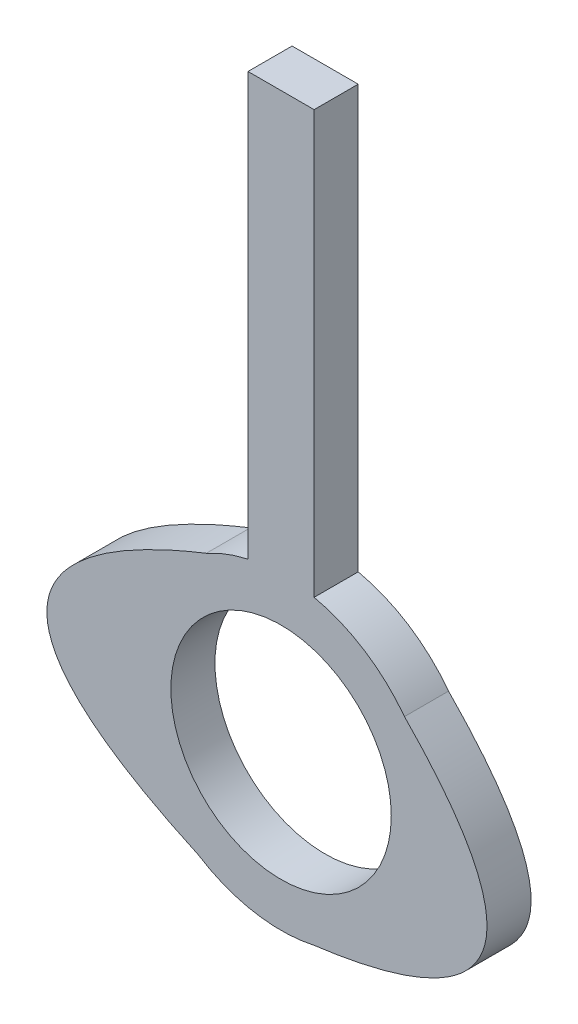
ISO-10303-21;
HEADER;
FILE_DESCRIPTION(('STEP AP214'),'2;1');
FILE_NAME('part.step','',(''),(''),'','','');
FILE_SCHEMA(('AUTOMOTIVE_DESIGN { 1 0 10303 214 1 1 1 1 }'));
ENDSEC;
DATA;
#1=APPLICATION_CONTEXT('core data for automotive mechanical design processes');
#2=APPLICATION_PROTOCOL_DEFINITION('international standard','automotive_design',2000,#1);
#3=PRODUCT_CONTEXT('',#1,'mechanical');
#4=PRODUCT('Part','Part','',(#3));
#5=PRODUCT_RELATED_PRODUCT_CATEGORY('part','',(#4));
#6=PRODUCT_DEFINITION_FORMATION('','',#4);
#7=PRODUCT_DEFINITION_CONTEXT('part definition',#1,'design');
#8=PRODUCT_DEFINITION('design','',#6,#7);
#9=PRODUCT_DEFINITION_SHAPE('','',#8);
#10=(LENGTH_UNIT() NAMED_UNIT(*) SI_UNIT(.MILLI.,.METRE.));
#11=(NAMED_UNIT(*) PLANE_ANGLE_UNIT() SI_UNIT($,.RADIAN.));
#12=(NAMED_UNIT(*) SI_UNIT($,.STERADIAN.) SOLID_ANGLE_UNIT());
#13=UNCERTAINTY_MEASURE_WITH_UNIT(LENGTH_MEASURE(1.E-05),#10,'distance_accuracy_value','');
#14=(GEOMETRIC_REPRESENTATION_CONTEXT(3) GLOBAL_UNCERTAINTY_ASSIGNED_CONTEXT((#13)) GLOBAL_UNIT_ASSIGNED_CONTEXT((#10,
#11,#12)) REPRESENTATION_CONTEXT('',''));
#15=CARTESIAN_POINT('',(0.,0.,0.));
#16=DIRECTION('',(0.,0.,1.));
#17=DIRECTION('',(1.,0.,0.));
#18=AXIS2_PLACEMENT_3D('',#15,#16,#17);
#19=CARTESIAN_POINT('',(0.,0.,2.));
#20=DIRECTION('',(0.,0.,-1.));
#21=DIRECTION('',(-1.,0.,0.));
#22=AXIS2_PLACEMENT_3D('',#19,#20,#21);
#23=CYLINDRICAL_SURFACE('',#22,7.);
#24=CARTESIAN_POINT('',(0.,0.,0.));
#25=DIRECTION('',(0.,0.,1.));
#26=DIRECTION('',(1.,0.,0.));
#27=AXIS2_PLACEMENT_3D('',#24,#25,#26);
#28=CIRCLE('',#27,7.);
#29=CARTESIAN_POINT('',(-1.5,6.83739716558867,0.));
#30=VERTEX_POINT('',#29);
#31=CARTESIAN_POINT('',(-3.39361088650415,6.12236924327506,0.));
#32=VERTEX_POINT('',#31);
#33=EDGE_CURVE('E123',#30,#32,#28,.T.);
#34=ORIENTED_EDGE('',*,*,#33,.T.);
#35=DIRECTION('',(0.,0.,-1.));
#36=VECTOR('',#35,1.);
#37=CARTESIAN_POINT('',(-3.39361088650415,6.12236924327506,17.9490187588302));
#38=LINE('',#37,#36);
#39=CARTESIAN_POINT('',(-3.39361088650415,6.12236924327506,2.));
#40=VERTEX_POINT('',#39);
#41=EDGE_CURVE('E128',#40,#32,#38,.T.);
#42=ORIENTED_EDGE('',*,*,#41,.F.);
#43=CARTESIAN_POINT('',(0.,0.,2.));
#44=DIRECTION('',(0.,0.,1.));
#45=DIRECTION('',(1.,0.,0.));
#46=AXIS2_PLACEMENT_3D('',#43,#44,#45);
#47=CIRCLE('',#46,7.);
#48=CARTESIAN_POINT('',(-1.5,6.83739716558867,2.));
#49=VERTEX_POINT('',#48);
#50=EDGE_CURVE('E170',#49,#40,#47,.T.);
#51=ORIENTED_EDGE('',*,*,#50,.F.);
#52=DIRECTION('',(0.,0.,-1.));
#53=VECTOR('',#52,1.);
#54=CARTESIAN_POINT('',(-1.5,6.83739716558867,2.));
#55=LINE('',#54,#53);
#56=EDGE_CURVE('E138',#49,#30,#55,.T.);
#57=ORIENTED_EDGE('',*,*,#56,.T.);
#58=EDGE_LOOP('',(#34,#42,#51,#57));
#59=FACE_BOUND('',#58,.T.);
#60=ADVANCED_FACE('F49',(#59),#23,.T.);
#61=DIRECTION('',(0.,0.,-1.));
#62=VECTOR('',#61,1.);
#63=CARTESIAN_POINT('',(1.5046549573764,-6.83637429192131,1.));
#64=LINE('',#63,#62);
#65=CARTESIAN_POINT('',(1.50465495737639,-6.83637429192131,0.));
#66=VERTEX_POINT('',#65);
#67=CARTESIAN_POINT('',(1.50465495737639,-6.83637429192131,2.));
#68=VERTEX_POINT('',#67);
#69=EDGE_CURVE('E13',#66,#68,#64,.F.);
#70=ORIENTED_EDGE('',*,*,#69,.T.);
#71=CARTESIAN_POINT('',(-3.75816222011164,-5.90560892096027,2.));
#72=VERTEX_POINT('',#71);
#73=EDGE_CURVE('E174',#72,#68,#47,.T.);
#74=ORIENTED_EDGE('',*,*,#73,.F.);
#75=DIRECTION('',(0.,0.,-1.));
#76=VECTOR('',#75,1.);
#77=CARTESIAN_POINT('',(-3.75816222011164,-5.90560892096027,1.));
#78=LINE('',#77,#76);
#79=CARTESIAN_POINT('',(-3.75816222011164,-5.90560892096027,0.));
#80=VERTEX_POINT('',#79);
#81=EDGE_CURVE('E134',#72,#80,#78,.T.);
#82=ORIENTED_EDGE('',*,*,#81,.T.);
#83=EDGE_CURVE('E124',#80,#66,#28,.T.);
#84=ORIENTED_EDGE('',*,*,#83,.T.);
#85=EDGE_LOOP('',(#70,#74,#82,#84));
#86=FACE_BOUND('',#85,.T.);
#87=ADVANCED_FACE('F222',(#86),#23,.T.);
#88=CARTESIAN_POINT('',(0.,0.,2.));
#89=DIRECTION('',(0.,0.,1.));
#90=DIRECTION('',(1.,0.,0.));
#91=AXIS2_PLACEMENT_3D('',#88,#89,#90);
#92=PLANE('',#91);
#93=ORIENTED_EDGE('',*,*,#50,.T.);
#94=CARTESIAN_POINT('',(-1.67750849633413,-6.79602569482538,2.));
#95=CARTESIAN_POINT('',(-18.6682253539975,0.0497370956610045,2.));
#96=CARTESIAN_POINT('',(-3.39361088650415,6.12236924327506,2.));
#97=B_SPLINE_CURVE_WITH_KNOTS('',2,(#94,#95,#96),.UNSPECIFIED.,.F.,.F.,(3,3),(0.,1.),.UNSPECIFIED.);
#98=EDGE_CURVE('E65',#72,#40,#97,.T.);
#99=ORIENTED_EDGE('',*,*,#98,.F.);
#100=ORIENTED_EDGE('',*,*,#73,.T.);
#101=CARTESIAN_POINT('',(5.59927876279492,4.20096147762792,2.));
#102=CARTESIAN_POINT('',(15.2580119407715,-5.62812595878675,2.));
#103=CARTESIAN_POINT('',(0.,-7.,2.));
#104=B_SPLINE_CURVE_WITH_KNOTS('',2,(#101,#102,#103),.UNSPECIFIED.,.F.,.F.,(3,3),(0.,1.),.UNSPECIFIED.);
#105=CARTESIAN_POINT('',(5.59927876279492,4.20096147762792,2.));
#106=VERTEX_POINT('',#105);
#107=EDGE_CURVE('E224',#106,#68,#104,.T.);
#108=ORIENTED_EDGE('',*,*,#107,.F.);
#109=CARTESIAN_POINT('',(1.5,6.83739716558867,2.));
#110=VERTEX_POINT('',#109);
#111=EDGE_CURVE('E175',#106,#110,#47,.T.);
#112=ORIENTED_EDGE('',*,*,#111,.T.);
#113=DIRECTION('',(0.,1.,0.));
#114=VECTOR('',#113,1.);
#115=CARTESIAN_POINT('',(1.5,6.83739716558867,2.));
#116=LINE('',#115,#114);
#117=CARTESIAN_POINT('',(1.5,26.,2.));
#118=VERTEX_POINT('',#117);
#119=EDGE_CURVE('E173',#110,#118,#116,.T.);
#120=ORIENTED_EDGE('',*,*,#119,.T.);
#121=DIRECTION('',(-1.,0.,0.));
#122=VECTOR('',#121,1.);
#123=CARTESIAN_POINT('',(-1.5,26.,2.));
#124=LINE('',#123,#122);
#125=CARTESIAN_POINT('',(-1.5,26.,2.));
#126=VERTEX_POINT('',#125);
#127=EDGE_CURVE('E178',#118,#126,#124,.T.);
#128=ORIENTED_EDGE('',*,*,#127,.T.);
#129=DIRECTION('',(0.,-1.,0.));
#130=VECTOR('',#129,1.);
#131=CARTESIAN_POINT('',(-1.5,6.83739716558867,2.));
#132=LINE('',#131,#130);
#133=EDGE_CURVE('E180',#126,#49,#132,.T.);
#134=ORIENTED_EDGE('',*,*,#133,.T.);
#135=EDGE_LOOP('',(#93,#99,#100,#108,#112,#120,#128,#134));
#136=FACE_BOUND('',#135,.T.);
#137=CARTESIAN_POINT('',(0.,0.,2.));
#138=DIRECTION('',(0.,0.,1.));
#139=DIRECTION('',(1.,0.,0.));
#140=AXIS2_PLACEMENT_3D('',#137,#138,#139);
#141=CIRCLE('',#140,5.);
#142=CARTESIAN_POINT('',(5.,0.,2.));
#143=VERTEX_POINT('',#142);
#144=EDGE_CURVE('E149',#143,#143,#141,.T.);
#145=ORIENTED_EDGE('',*,*,#144,.F.);
#146=EDGE_LOOP('',(#145));
#147=FACE_BOUND('',#146,.T.);
#148=ADVANCED_FACE('F215',(#136,#147),#92,.T.);
#149=CARTESIAN_POINT('',(0.,0.,0.));
#150=DIRECTION('',(0.,0.,1.));
#151=DIRECTION('',(1.,0.,0.));
#152=AXIS2_PLACEMENT_3D('',#149,#150,#151);
#153=PLANE('',#152);
#154=CARTESIAN_POINT('',(5.59927876279492,4.20096147762792,0.));
#155=CARTESIAN_POINT('',(15.2580119407715,-5.62812595878675,0.));
#156=CARTESIAN_POINT('',(0.,-7.,0.));
#157=B_SPLINE_CURVE_WITH_KNOTS('',2,(#154,#155,#156),.UNSPECIFIED.,.F.,.F.,(3,3),(0.,1.),.UNSPECIFIED.);
#158=CARTESIAN_POINT('',(5.59927876279492,4.20096147762792,0.));
#159=VERTEX_POINT('',#158);
#160=EDGE_CURVE('E73',#159,#66,#157,.T.);
#161=ORIENTED_EDGE('',*,*,#160,.T.);
#162=ORIENTED_EDGE('',*,*,#83,.F.);
#163=CARTESIAN_POINT('',(-1.67750849633413,-6.79602569482538,0.));
#164=CARTESIAN_POINT('',(-18.6682253539975,0.0497370956610045,0.));
#165=CARTESIAN_POINT('',(-3.39361088650415,6.12236924327506,0.));
#166=B_SPLINE_CURVE_WITH_KNOTS('',2,(#163,#164,#165),.UNSPECIFIED.,.F.,.F.,(3,3),(0.,1.),.UNSPECIFIED.);
#167=EDGE_CURVE('E118',#80,#32,#166,.T.);
#168=ORIENTED_EDGE('',*,*,#167,.T.);
#169=ORIENTED_EDGE('',*,*,#33,.F.);
#170=DIRECTION('',(0.,-1.,0.));
#171=VECTOR('',#170,1.);
#172=CARTESIAN_POINT('',(-1.5,6.83739716558867,0.));
#173=LINE('',#172,#171);
#174=CARTESIAN_POINT('',(-1.5,26.,0.));
#175=VERTEX_POINT('',#174);
#176=EDGE_CURVE('E192',#175,#30,#173,.T.);
#177=ORIENTED_EDGE('',*,*,#176,.F.);
#178=DIRECTION('',(-1.,0.,0.));
#179=VECTOR('',#178,1.);
#180=CARTESIAN_POINT('',(-1.5,26.,0.));
#181=LINE('',#180,#179);
#182=CARTESIAN_POINT('',(1.5,26.,0.));
#183=VERTEX_POINT('',#182);
#184=EDGE_CURVE('E145',#183,#175,#181,.T.);
#185=ORIENTED_EDGE('',*,*,#184,.F.);
#186=DIRECTION('',(0.,1.,0.));
#187=VECTOR('',#186,1.);
#188=CARTESIAN_POINT('',(1.5,6.83739716558867,0.));
#189=LINE('',#188,#187);
#190=CARTESIAN_POINT('',(1.5,6.83739716558867,0.));
#191=VERTEX_POINT('',#190);
#192=EDGE_CURVE('E140',#191,#183,#189,.T.);
#193=ORIENTED_EDGE('',*,*,#192,.F.);
#194=EDGE_CURVE('E142',#159,#191,#28,.T.);
#195=ORIENTED_EDGE('',*,*,#194,.F.);
#196=EDGE_LOOP('',(#161,#162,#168,#169,#177,#185,#193,#195));
#197=FACE_BOUND('',#196,.T.);
#198=CARTESIAN_POINT('',(0.,0.,0.));
#199=DIRECTION('',(0.,0.,1.));
#200=DIRECTION('',(1.,0.,0.));
#201=AXIS2_PLACEMENT_3D('',#198,#199,#200);
#202=CIRCLE('',#201,5.);
#203=CARTESIAN_POINT('',(5.,0.,0.));
#204=VERTEX_POINT('',#203);
#205=EDGE_CURVE('E156',#204,#204,#202,.T.);
#206=ORIENTED_EDGE('',*,*,#205,.T.);
#207=EDGE_LOOP('',(#206));
#208=FACE_BOUND('',#207,.T.);
#209=ADVANCED_FACE('F119',(#197,#208),#153,.F.);
#210=ORIENTED_EDGE('',*,*,#111,.F.);
#211=DIRECTION('',(0.,0.,-1.));
#212=VECTOR('',#211,1.);
#213=CARTESIAN_POINT('',(5.59927876279492,4.20096147762792,17.9490187588302));
#214=LINE('',#213,#212);
#215=EDGE_CURVE('E162',#106,#159,#214,.T.);
#216=ORIENTED_EDGE('',*,*,#215,.T.);
#217=ORIENTED_EDGE('',*,*,#194,.T.);
#218=DIRECTION('',(0.,0.,-1.));
#219=VECTOR('',#218,1.);
#220=CARTESIAN_POINT('',(1.5,6.83739716558867,2.));
#221=LINE('',#220,#219);
#222=EDGE_CURVE('E58',#110,#191,#221,.T.);
#223=ORIENTED_EDGE('',*,*,#222,.F.);
#224=EDGE_LOOP('',(#210,#216,#217,#223));
#225=FACE_BOUND('',#224,.T.);
#226=ADVANCED_FACE('F51',(#225),#23,.T.);
#227=CARTESIAN_POINT('',(1.5,6.83739716558867,2.));
#228=DIRECTION('',(-1.,0.,0.));
#229=DIRECTION('',(0.,0.,1.));
#230=AXIS2_PLACEMENT_3D('',#227,#228,#229);
#231=PLANE('',#230);
#232=ORIENTED_EDGE('',*,*,#192,.T.);
#233=DIRECTION('',(0.,0.,-1.));
#234=VECTOR('',#233,1.);
#235=CARTESIAN_POINT('',(1.5,26.,2.));
#236=LINE('',#235,#234);
#237=EDGE_CURVE('E189',#118,#183,#236,.T.);
#238=ORIENTED_EDGE('',*,*,#237,.F.);
#239=ORIENTED_EDGE('',*,*,#119,.F.);
#240=ORIENTED_EDGE('',*,*,#222,.T.);
#241=EDGE_LOOP('',(#232,#238,#239,#240));
#242=FACE_BOUND('',#241,.T.);
#243=ADVANCED_FACE('F201',(#242),#231,.F.);
#244=CARTESIAN_POINT('',(-1.5,26.,2.));
#245=DIRECTION('',(0.,-1.,0.));
#246=DIRECTION('',(0.,0.,-1.));
#247=AXIS2_PLACEMENT_3D('',#244,#245,#246);
#248=PLANE('',#247);
#249=ORIENTED_EDGE('',*,*,#184,.T.);
#250=DIRECTION('',(0.,0.,-1.));
#251=VECTOR('',#250,1.);
#252=CARTESIAN_POINT('',(-1.5,26.,2.));
#253=LINE('',#252,#251);
#254=EDGE_CURVE('E185',#126,#175,#253,.T.);
#255=ORIENTED_EDGE('',*,*,#254,.F.);
#256=ORIENTED_EDGE('',*,*,#127,.F.);
#257=ORIENTED_EDGE('',*,*,#237,.T.);
#258=EDGE_LOOP('',(#249,#255,#256,#257));
#259=FACE_BOUND('',#258,.T.);
#260=ADVANCED_FACE('F212',(#259),#248,.F.);
#261=CARTESIAN_POINT('',(-1.5,6.83739716558867,2.));
#262=DIRECTION('',(1.,0.,0.));
#263=DIRECTION('',(0.,0.,-1.));
#264=AXIS2_PLACEMENT_3D('',#261,#262,#263);
#265=PLANE('',#264);
#266=ORIENTED_EDGE('',*,*,#176,.T.);
#267=ORIENTED_EDGE('',*,*,#56,.F.);
#268=ORIENTED_EDGE('',*,*,#133,.F.);
#269=ORIENTED_EDGE('',*,*,#254,.T.);
#270=EDGE_LOOP('',(#266,#267,#268,#269));
#271=FACE_BOUND('',#270,.T.);
#272=ADVANCED_FACE('F214',(#271),#265,.F.);
#273=CARTESIAN_POINT('',(0.,0.,2.));
#274=DIRECTION('',(0.,0.,-1.));
#275=DIRECTION('',(-1.,0.,0.));
#276=AXIS2_PLACEMENT_3D('',#273,#274,#275);
#277=CYLINDRICAL_SURFACE('',#276,5.);
#278=ORIENTED_EDGE('',*,*,#144,.T.);
#279=EDGE_LOOP('',(#278));
#280=FACE_BOUND('',#279,.T.);
#281=ORIENTED_EDGE('',*,*,#205,.F.);
#282=EDGE_LOOP('',(#281));
#283=FACE_BOUND('',#282,.T.);
#284=ADVANCED_FACE('F254',(#280,#283),#277,.F.);
#285=CARTESIAN_POINT('',(5.59927876279492,4.20096147762792,17.9490187588302));
#286=CARTESIAN_POINT('',(15.2580119407715,-5.62812595878675,17.9490187588302));
#287=CARTESIAN_POINT('',(0.,-7.,17.9490187588302));
#288=B_SPLINE_CURVE_WITH_KNOTS('',2,(#285,#286,#287),.UNSPECIFIED.,.F.,.F.,(3,3),(0.,1.),.UNSPECIFIED.);
#289=DIRECTION('',(0.,0.,-1.));
#290=VECTOR('',#289,1.);
#291=SURFACE_OF_LINEAR_EXTRUSION('',#288,#290);
#292=ORIENTED_EDGE('',*,*,#69,.F.);
#293=ORIENTED_EDGE('',*,*,#160,.F.);
#294=ORIENTED_EDGE('',*,*,#215,.F.);
#295=ORIENTED_EDGE('',*,*,#107,.T.);
#296=EDGE_LOOP('',(#292,#293,#294,#295));
#297=FACE_BOUND('',#296,.T.);
#298=ADVANCED_FACE('F223',(#297),#291,.T.);
#299=CARTESIAN_POINT('',(-1.67750849633413,-6.79602569482538,17.9490187588302));
#300=CARTESIAN_POINT('',(-18.6682253539975,0.0497370956610045,17.9490187588302));
#301=CARTESIAN_POINT('',(-3.39361088650415,6.12236924327506,17.9490187588302));
#302=B_SPLINE_CURVE_WITH_KNOTS('',2,(#299,#300,#301),.UNSPECIFIED.,.F.,.F.,(3,3),(0.,1.),.UNSPECIFIED.);
#303=DIRECTION('',(0.,0.,-1.));
#304=VECTOR('',#303,1.);
#305=SURFACE_OF_LINEAR_EXTRUSION('',#302,#304);
#306=ORIENTED_EDGE('',*,*,#81,.F.);
#307=ORIENTED_EDGE('',*,*,#98,.T.);
#308=ORIENTED_EDGE('',*,*,#41,.T.);
#309=ORIENTED_EDGE('',*,*,#167,.F.);
#310=EDGE_LOOP('',(#306,#307,#308,#309));
#311=FACE_BOUND('',#310,.T.);
#312=ADVANCED_FACE('F129',(#311),#305,.T.);
#313=CLOSED_SHELL('',(#60,#87,#148,#209,#226,#243,#260,#272,#284,#298,#312));
#314=MANIFOLD_SOLID_BREP('B2',#313);
#315=ADVANCED_BREP_SHAPE_REPRESENTATION('',(#18,#314),#14);
#316=SHAPE_DEFINITION_REPRESENTATION(#9,#315);
ENDSEC;
END-ISO-10303-21;
